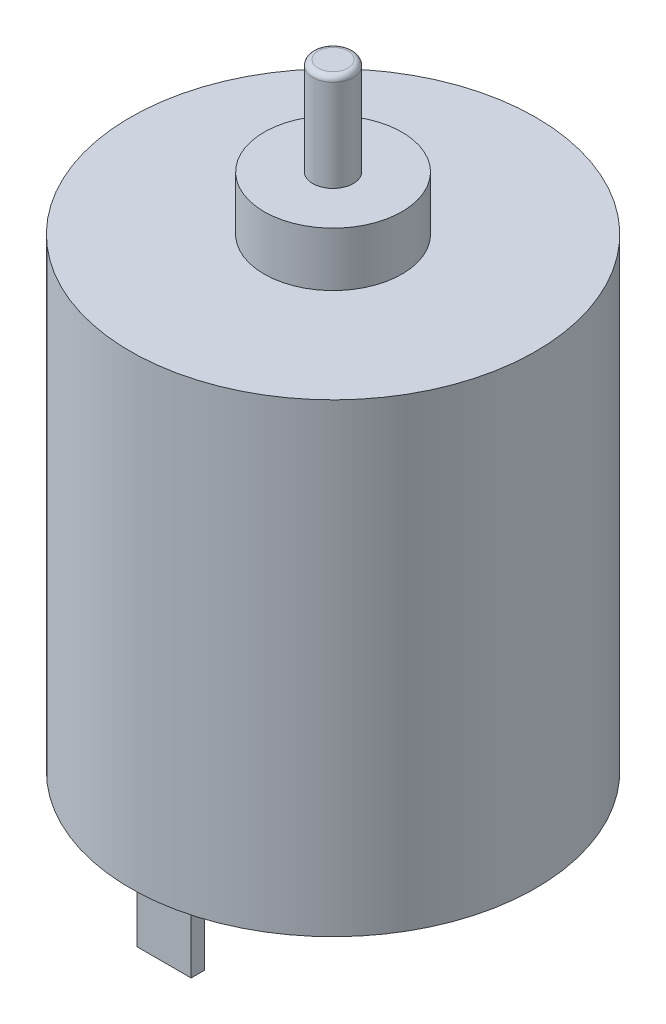
ISO-10303-21;
HEADER;
FILE_DESCRIPTION(('STEP AP214'),'2;1');
FILE_NAME('part.step','',(''),(''),'','','');
FILE_SCHEMA(('AUTOMOTIVE_DESIGN { 1 0 10303 214 1 1 1 1 }'));
ENDSEC;
DATA;
#1=APPLICATION_CONTEXT('core data for automotive mechanical design processes');
#2=APPLICATION_PROTOCOL_DEFINITION('international standard','automotive_design',2000,#1);
#3=PRODUCT_CONTEXT('',#1,'mechanical');
#4=PRODUCT('Part','Part','',(#3));
#5=PRODUCT_RELATED_PRODUCT_CATEGORY('part','',(#4));
#6=PRODUCT_DEFINITION_FORMATION('','',#4);
#7=PRODUCT_DEFINITION_CONTEXT('part definition',#1,'design');
#8=PRODUCT_DEFINITION('design','',#6,#7);
#9=PRODUCT_DEFINITION_SHAPE('','',#8);
#10=(LENGTH_UNIT() NAMED_UNIT(*) SI_UNIT(.MILLI.,.METRE.));
#11=(NAMED_UNIT(*) PLANE_ANGLE_UNIT() SI_UNIT($,.RADIAN.));
#12=(NAMED_UNIT(*) SI_UNIT($,.STERADIAN.) SOLID_ANGLE_UNIT());
#13=UNCERTAINTY_MEASURE_WITH_UNIT(LENGTH_MEASURE(1.E-05),#10,'distance_accuracy_value','');
#14=(GEOMETRIC_REPRESENTATION_CONTEXT(3) GLOBAL_UNCERTAINTY_ASSIGNED_CONTEXT((#13)) GLOBAL_UNIT_ASSIGNED_CONTEXT((#10,
#11,#12)) REPRESENTATION_CONTEXT('',''));
#15=CARTESIAN_POINT('',(0.,0.,0.));
#16=DIRECTION('',(0.,0.,1.));
#17=DIRECTION('',(1.,0.,0.));
#18=AXIS2_PLACEMENT_3D('',#15,#16,#17);
#19=CARTESIAN_POINT('',(0.,0.,0.));
#20=DIRECTION('',(0.,1.,0.));
#21=DIRECTION('',(0.,0.,1.));
#22=AXIS2_PLACEMENT_3D('',#19,#20,#21);
#23=PLANE('',#22);
#24=DIRECTION('',(0.,0.,1.));
#25=VECTOR('',#24,1.);
#26=CARTESIAN_POINT('',(0.999999999999997,0.,5.75000000000001));
#27=LINE('',#26,#25);
#28=CARTESIAN_POINT('',(0.999999999999997,0.,5.75000000000001));
#29=VERTEX_POINT('',#28);
#30=CARTESIAN_POINT('',(1.00000000000001,0.,6.25000000000002));
#31=VERTEX_POINT('',#30);
#32=EDGE_CURVE('E122',#29,#31,#27,.T.);
#33=ORIENTED_EDGE('',*,*,#32,.F.);
#34=DIRECTION('',(1.,0.,0.));
#35=VECTOR('',#34,1.);
#36=CARTESIAN_POINT('',(-1.,0.,5.75000000000001));
#37=LINE('',#36,#35);
#38=CARTESIAN_POINT('',(-1.,0.,5.75000000000001));
#39=VERTEX_POINT('',#38);
#40=EDGE_CURVE('E135',#39,#29,#37,.T.);
#41=ORIENTED_EDGE('',*,*,#40,.F.);
#42=DIRECTION('',(0.,0.,-1.));
#43=VECTOR('',#42,1.);
#44=CARTESIAN_POINT('',(-1.,0.,5.75000000000001));
#45=LINE('',#44,#43);
#46=CARTESIAN_POINT('',(-1.,0.,6.25000000000002));
#47=VERTEX_POINT('',#46);
#48=EDGE_CURVE('E144',#47,#39,#45,.T.);
#49=ORIENTED_EDGE('',*,*,#48,.F.);
#50=DIRECTION('',(-1.,0.,0.));
#51=VECTOR('',#50,1.);
#52=CARTESIAN_POINT('',(-1.,0.,6.25000000000002));
#53=LINE('',#52,#51);
#54=EDGE_CURVE('E125',#31,#47,#53,.T.);
#55=ORIENTED_EDGE('',*,*,#54,.F.);
#56=EDGE_LOOP('',(#33,#41,#49,#55));
#57=FACE_BOUND('',#56,.T.);
#58=CARTESIAN_POINT('',(0.,0.,0.));
#59=DIRECTION('',(0.,1.,0.));
#60=DIRECTION('',(0.,0.,1.));
#61=AXIS2_PLACEMENT_3D('',#58,#59,#60);
#62=CIRCLE('',#61,7.5);
#63=CARTESIAN_POINT('',(0.,0.,-7.50000000000002));
#64=VERTEX_POINT('',#63);
#65=EDGE_CURVE('E167',#64,#64,#62,.T.);
#66=ORIENTED_EDGE('',*,*,#65,.F.);
#67=EDGE_LOOP('',(#66));
#68=FACE_BOUND('',#67,.T.);
#69=DIRECTION('',(0.,0.,1.));
#70=VECTOR('',#69,1.);
#71=CARTESIAN_POINT('',(1.,0.,-5.75000000000001));
#72=LINE('',#71,#70);
#73=CARTESIAN_POINT('',(1.00000000000002,0.,-6.25000000000003));
#74=VERTEX_POINT('',#73);
#75=CARTESIAN_POINT('',(1.,0.,-5.75000000000001));
#76=VERTEX_POINT('',#75);
#77=EDGE_CURVE('E121',#74,#76,#72,.T.);
#78=ORIENTED_EDGE('',*,*,#77,.F.);
#79=DIRECTION('',(1.,0.,0.));
#80=VECTOR('',#79,1.);
#81=CARTESIAN_POINT('',(-1.,0.,-6.25000000000003));
#82=LINE('',#81,#80);
#83=CARTESIAN_POINT('',(-1.,0.,-6.25000000000003));
#84=VERTEX_POINT('',#83);
#85=EDGE_CURVE('E118',#84,#74,#82,.T.);
#86=ORIENTED_EDGE('',*,*,#85,.F.);
#87=DIRECTION('',(0.,0.,-1.));
#88=VECTOR('',#87,1.);
#89=CARTESIAN_POINT('',(-1.,0.,-5.75000000000001));
#90=LINE('',#89,#88);
#91=CARTESIAN_POINT('',(-1.,0.,-5.75000000000001));
#92=VERTEX_POINT('',#91);
#93=EDGE_CURVE('E56',#92,#84,#90,.T.);
#94=ORIENTED_EDGE('',*,*,#93,.F.);
#95=DIRECTION('',(-1.,0.,0.));
#96=VECTOR('',#95,1.);
#97=CARTESIAN_POINT('',(-1.,0.,-5.75000000000001));
#98=LINE('',#97,#96);
#99=EDGE_CURVE('E51',#76,#92,#98,.T.);
#100=ORIENTED_EDGE('',*,*,#99,.F.);
#101=EDGE_LOOP('',(#78,#86,#94,#100));
#102=FACE_BOUND('',#101,.T.);
#103=ADVANCED_FACE('F36',(#57,#68,#102),#23,.F.);
#104=CARTESIAN_POINT('',(0.,19.2,0.));
#105=DIRECTION('',(0.,1.,0.));
#106=DIRECTION('',(0.,0.,1.));
#107=AXIS2_PLACEMENT_3D('',#104,#105,#106);
#108=PLANE('',#107);
#109=CARTESIAN_POINT('',(0.,19.2,0.));
#110=DIRECTION('',(0.,1.,0.));
#111=DIRECTION('',(0.,0.,1.));
#112=AXIS2_PLACEMENT_3D('',#109,#110,#111);
#113=CIRCLE('',#112,2.55);
#114=CARTESIAN_POINT('',(0.,19.2,2.55000000000001));
#115=VERTEX_POINT('',#114);
#116=EDGE_CURVE('E164',#115,#115,#113,.T.);
#117=ORIENTED_EDGE('',*,*,#116,.T.);
#118=EDGE_LOOP('',(#117));
#119=FACE_BOUND('',#118,.T.);
#120=CARTESIAN_POINT('',(0.,19.2,0.));
#121=DIRECTION('',(0.,1.,0.));
#122=DIRECTION('',(0.,0.,1.));
#123=AXIS2_PLACEMENT_3D('',#120,#121,#122);
#124=CIRCLE('',#123,0.75);
#125=CARTESIAN_POINT('',(0.,19.2,0.750000000000003));
#126=VERTEX_POINT('',#125);
#127=EDGE_CURVE('E160',#126,#126,#124,.T.);
#128=ORIENTED_EDGE('',*,*,#127,.F.);
#129=EDGE_LOOP('',(#128));
#130=FACE_BOUND('',#129,.T.);
#131=ADVANCED_FACE('F188',(#119,#130),#108,.T.);
#132=CARTESIAN_POINT('',(0.,17.2,0.));
#133=DIRECTION('',(0.,1.,0.));
#134=DIRECTION('',(0.,0.,1.));
#135=AXIS2_PLACEMENT_3D('',#132,#133,#134);
#136=PLANE('',#135);
#137=CARTESIAN_POINT('',(0.,17.2,0.));
#138=DIRECTION('',(0.,1.,0.));
#139=DIRECTION('',(0.,0.,1.));
#140=AXIS2_PLACEMENT_3D('',#137,#138,#139);
#141=CIRCLE('',#140,7.5);
#142=CARTESIAN_POINT('',(0.,17.2,-7.50000000000002));
#143=VERTEX_POINT('',#142);
#144=EDGE_CURVE('E170',#143,#143,#141,.T.);
#145=ORIENTED_EDGE('',*,*,#144,.T.);
#146=EDGE_LOOP('',(#145));
#147=FACE_BOUND('',#146,.T.);
#148=CARTESIAN_POINT('',(0.,17.2,0.));
#149=DIRECTION('',(0.,1.,0.));
#150=DIRECTION('',(0.,0.,1.));
#151=AXIS2_PLACEMENT_3D('',#148,#149,#150);
#152=CIRCLE('',#151,2.55);
#153=CARTESIAN_POINT('',(0.,17.2,2.55000000000001));
#154=VERTEX_POINT('',#153);
#155=EDGE_CURVE('E163',#154,#154,#152,.T.);
#156=ORIENTED_EDGE('',*,*,#155,.F.);
#157=EDGE_LOOP('',(#156));
#158=FACE_BOUND('',#157,.T.);
#159=ADVANCED_FACE('F194',(#147,#158),#136,.T.);
#160=CARTESIAN_POINT('',(0.,17.2,0.));
#161=DIRECTION('',(0.,-1.,0.));
#162=DIRECTION('',(0.,0.,-1.));
#163=AXIS2_PLACEMENT_3D('',#160,#161,#162);
#164=CYLINDRICAL_SURFACE('',#163,7.5);
#165=CARTESIAN_POINT('',(0.,17.2,-7.50000000000002));
#166=CARTESIAN_POINT('',(0.,17.0208333333333,-7.50000000000002));
#167=CARTESIAN_POINT('',(0.,16.8416666666667,-7.50000000000002));
#168=CARTESIAN_POINT('',(0.,16.4833333333333,-7.50000000000002));
#169=CARTESIAN_POINT('',(0.,16.3041666666667,-7.50000000000002));
#170=CARTESIAN_POINT('',(0.,15.9458333333333,-7.50000000000002));
#171=CARTESIAN_POINT('',(0.,15.7666666666667,-7.50000000000002));
#172=CARTESIAN_POINT('',(0.,15.4083333333333,-7.50000000000002));
#173=CARTESIAN_POINT('',(0.,15.2291666666667,-7.50000000000002));
#174=CARTESIAN_POINT('',(0.,14.8708333333333,-7.50000000000002));
#175=CARTESIAN_POINT('',(0.,14.6916666666667,-7.50000000000002));
#176=CARTESIAN_POINT('',(0.,14.3333333333333,-7.50000000000002));
#177=CARTESIAN_POINT('',(0.,14.1541666666667,-7.50000000000002));
#178=CARTESIAN_POINT('',(0.,13.7958333333333,-7.50000000000002));
#179=CARTESIAN_POINT('',(0.,13.6166666666667,-7.50000000000002));
#180=CARTESIAN_POINT('',(0.,13.2583333333333,-7.50000000000002));
#181=CARTESIAN_POINT('',(0.,13.0791666666667,-7.50000000000002));
#182=CARTESIAN_POINT('',(0.,12.7208333333333,-7.50000000000002));
#183=CARTESIAN_POINT('',(0.,12.5416666666667,-7.50000000000002));
#184=CARTESIAN_POINT('',(0.,12.1833333333333,-7.50000000000002));
#185=CARTESIAN_POINT('',(0.,12.0041666666667,-7.50000000000002));
#186=CARTESIAN_POINT('',(0.,11.6458333333333,-7.50000000000002));
#187=CARTESIAN_POINT('',(0.,11.4666666666667,-7.50000000000002));
#188=CARTESIAN_POINT('',(0.,11.1083333333333,-7.50000000000002));
#189=CARTESIAN_POINT('',(0.,10.9291666666667,-7.50000000000002));
#190=CARTESIAN_POINT('',(0.,10.5708333333333,-7.50000000000002));
#191=CARTESIAN_POINT('',(0.,10.3916666666667,-7.50000000000002));
#192=CARTESIAN_POINT('',(0.,10.0333333333333,-7.50000000000002));
#193=CARTESIAN_POINT('',(0.,9.85416666666666,-7.50000000000002));
#194=CARTESIAN_POINT('',(0.,9.49583333333333,-7.50000000000002));
#195=CARTESIAN_POINT('',(0.,9.31666666666666,-7.50000000000002));
#196=CARTESIAN_POINT('',(0.,8.95833333333333,-7.50000000000002));
#197=CARTESIAN_POINT('',(0.,8.77916666666666,-7.50000000000002));
#198=CARTESIAN_POINT('',(0.,8.42083333333333,-7.50000000000002));
#199=CARTESIAN_POINT('',(0.,8.24166666666666,-7.50000000000002));
#200=CARTESIAN_POINT('',(0.,7.88333333333333,-7.50000000000002));
#201=CARTESIAN_POINT('',(0.,7.70416666666666,-7.50000000000002));
#202=CARTESIAN_POINT('',(0.,7.34583333333333,-7.50000000000002));
#203=CARTESIAN_POINT('',(0.,7.16666666666666,-7.50000000000002));
#204=CARTESIAN_POINT('',(0.,6.80833333333333,-7.50000000000002));
#205=CARTESIAN_POINT('',(0.,6.62916666666666,-7.50000000000002));
#206=CARTESIAN_POINT('',(0.,6.27083333333333,-7.50000000000002));
#207=CARTESIAN_POINT('',(0.,6.09166666666666,-7.50000000000002));
#208=CARTESIAN_POINT('',(0.,5.73333333333333,-7.50000000000002));
#209=CARTESIAN_POINT('',(0.,5.55416666666666,-7.50000000000002));
#210=CARTESIAN_POINT('',(0.,5.19583333333333,-7.50000000000002));
#211=CARTESIAN_POINT('',(0.,5.01666666666666,-7.50000000000002));
#212=CARTESIAN_POINT('',(0.,4.65833333333333,-7.50000000000002));
#213=CARTESIAN_POINT('',(0.,4.47916666666666,-7.50000000000002));
#214=CARTESIAN_POINT('',(0.,4.12083333333333,-7.50000000000002));
#215=CARTESIAN_POINT('',(0.,3.94166666666666,-7.50000000000002));
#216=CARTESIAN_POINT('',(0.,3.58333333333333,-7.50000000000002));
#217=CARTESIAN_POINT('',(0.,3.40416666666666,-7.50000000000002));
#218=CARTESIAN_POINT('',(0.,3.04583333333333,-7.50000000000002));
#219=CARTESIAN_POINT('',(0.,2.86666666666666,-7.50000000000002));
#220=CARTESIAN_POINT('',(0.,2.50833333333333,-7.50000000000002));
#221=CARTESIAN_POINT('',(0.,2.32916666666666,-7.50000000000002));
#222=CARTESIAN_POINT('',(0.,1.97083333333333,-7.50000000000002));
#223=CARTESIAN_POINT('',(0.,1.79166666666666,-7.50000000000002));
#224=CARTESIAN_POINT('',(0.,1.43333333333333,-7.50000000000002));
#225=CARTESIAN_POINT('',(0.,1.25416666666666,-7.50000000000002));
#226=CARTESIAN_POINT('',(0.,0.895833333333329,-7.50000000000002));
#227=CARTESIAN_POINT('',(0.,0.716666666666663,-7.50000000000002));
#228=CARTESIAN_POINT('',(0.,0.35833333333333,-7.50000000000002));
#229=CARTESIAN_POINT('',(0.,0.179166666666663,-7.50000000000002));
#230=CARTESIAN_POINT('',(0.,0.,-7.50000000000002));
#231=B_SPLINE_CURVE_WITH_KNOTS('',3,(#165,#166,#167,#168,#169,#170,#171,#172,#173,#174,#175,
#176,#177,#178,#179,#180,#181,#182,#183,#184,#185,#186,#187,#188,#189,#190,#191,#192,#193,#194,
#195,#196,#197,#198,#199,#200,#201,#202,#203,#204,#205,#206,#207,#208,#209,#210,#211,#212,#213,
#214,#215,#216,#217,#218,#219,#220,#221,#222,#223,#224,#225,#226,#227,#228,#229,#230),
.UNSPECIFIED.,.F.,.F.,(4,2,2,2,2,2,2,2,2,2,2,2,2,2,2,2,2,2,2,2,2,2,2,2,2,2,2,2,2,2,2,2,4),(0.,
0.537500000000003,1.075,1.6125,2.15,2.6875,3.225,3.7625,4.3,4.8375,5.375,5.9125,6.45,6.9875,
7.525,8.0625,8.6,9.1375,9.675,10.2125,10.75,11.2875,11.825,12.3625,12.9,13.4375,13.975,14.5125,
15.05,15.5875,16.125,16.6625,17.2),.UNSPECIFIED.);
#232=EDGE_CURVE('BSEAM200',#143,#64,#231,.T.);
#233=ORIENTED_EDGE('',*,*,#144,.F.);
#234=ORIENTED_EDGE('',*,*,#65,.T.);
#235=ORIENTED_EDGE('',*,*,#232,.T.);
#236=ORIENTED_EDGE('',*,*,#232,.F.);
#237=EDGE_LOOP('',(#233,#235,#234,#236));
#238=FACE_BOUND('',#237,.T.);
#239=ADVANCED_FACE('F200',(#238),#164,.T.);
#240=CARTESIAN_POINT('',(0.,19.2,0.));
#241=DIRECTION('',(0.,-1.,0.));
#242=DIRECTION('',(0.,0.,-1.));
#243=AXIS2_PLACEMENT_3D('',#240,#241,#242);
#244=CYLINDRICAL_SURFACE('',#243,2.55);
#245=ORIENTED_EDGE('',*,*,#116,.F.);
#246=EDGE_LOOP('',(#245));
#247=FACE_BOUND('',#246,.T.);
#248=ORIENTED_EDGE('',*,*,#155,.T.);
#249=EDGE_LOOP('',(#248));
#250=FACE_BOUND('',#249,.T.);
#251=ADVANCED_FACE('F202',(#247,#250),#244,.T.);
#252=CARTESIAN_POINT('',(0.,22.8,0.));
#253=DIRECTION('',(0.,-1.,0.));
#254=DIRECTION('',(0.,0.,-1.));
#255=AXIS2_PLACEMENT_3D('',#252,#253,#254);
#256=CYLINDRICAL_SURFACE('',#255,0.75);
#257=CARTESIAN_POINT('',(0.,22.6,0.));
#258=DIRECTION('',(0.,1.,0.));
#259=DIRECTION('',(0.,0.,1.));
#260=AXIS2_PLACEMENT_3D('',#257,#258,#259);
#261=CIRCLE('',#260,0.75);
#262=CARTESIAN_POINT('',(0.,22.6,0.750000000000003));
#263=VERTEX_POINT('',#262);
#264=EDGE_CURVE('E11',#263,#263,#261,.F.);
#265=ORIENTED_EDGE('',*,*,#264,.T.);
#266=EDGE_LOOP('',(#265));
#267=FACE_BOUND('',#266,.T.);
#268=ORIENTED_EDGE('',*,*,#127,.T.);
#269=EDGE_LOOP('',(#268));
#270=FACE_BOUND('',#269,.T.);
#271=ADVANCED_FACE('F208',(#267,#270),#256,.T.);
#272=CARTESIAN_POINT('',(0.,22.8,0.));
#273=DIRECTION('',(0.,1.,0.));
#274=DIRECTION('',(0.,0.,1.));
#275=AXIS2_PLACEMENT_3D('',#272,#273,#274);
#276=PLANE('',#275);
#277=CARTESIAN_POINT('',(0.,22.8,0.));
#278=DIRECTION('',(0.,1.,0.));
#279=DIRECTION('',(0.,0.,1.));
#280=AXIS2_PLACEMENT_3D('',#277,#278,#279);
#281=CIRCLE('',#280,0.55);
#282=CARTESIAN_POINT('',(0.,22.8,0.550000000000002));
#283=VERTEX_POINT('',#282);
#284=EDGE_CURVE('E44',#283,#283,#281,.T.);
#285=ORIENTED_EDGE('',*,*,#284,.T.);
#286=EDGE_LOOP('',(#285));
#287=FACE_BOUND('',#286,.T.);
#288=ADVANCED_FACE('F177',(#287),#276,.T.);
#289=CARTESIAN_POINT('',(0.999999999999997,-3.,5.75000000000001));
#290=DIRECTION('',(-1.,0.,0.));
#291=DIRECTION('',(0.,0.,1.));
#292=AXIS2_PLACEMENT_3D('',#289,#290,#291);
#293=PLANE('',#292);
#294=ORIENTED_EDGE('',*,*,#32,.T.);
#295=DIRECTION('',(0.,1.,0.));
#296=VECTOR('',#295,1.);
#297=CARTESIAN_POINT('',(1.00000000000001,-3.,6.25000000000002));
#298=LINE('',#297,#296);
#299=CARTESIAN_POINT('',(1.00000000000001,-3.,6.25000000000002));
#300=VERTEX_POINT('',#299);
#301=EDGE_CURVE('E157',#300,#31,#298,.T.);
#302=ORIENTED_EDGE('',*,*,#301,.F.);
#303=DIRECTION('',(0.,0.,1.));
#304=VECTOR('',#303,1.);
#305=CARTESIAN_POINT('',(0.999999999999997,-3.,5.75000000000001));
#306=LINE('',#305,#304);
#307=CARTESIAN_POINT('',(0.999999999999997,-3.,5.75000000000001));
#308=VERTEX_POINT('',#307);
#309=EDGE_CURVE('E131',#308,#300,#306,.T.);
#310=ORIENTED_EDGE('',*,*,#309,.F.);
#311=DIRECTION('',(0.,1.,0.));
#312=VECTOR('',#311,1.);
#313=CARTESIAN_POINT('',(0.999999999999997,-3.,5.75000000000001));
#314=LINE('',#313,#312);
#315=EDGE_CURVE('E140',#308,#29,#314,.T.);
#316=ORIENTED_EDGE('',*,*,#315,.T.);
#317=EDGE_LOOP('',(#294,#302,#310,#316));
#318=FACE_BOUND('',#317,.T.);
#319=ADVANCED_FACE('F254',(#318),#293,.F.);
#320=CARTESIAN_POINT('',(-1.,-3.,6.25000000000002));
#321=DIRECTION('',(0.,0.,-1.));
#322=DIRECTION('',(-1.,0.,0.));
#323=AXIS2_PLACEMENT_3D('',#320,#321,#322);
#324=PLANE('',#323);
#325=ORIENTED_EDGE('',*,*,#54,.T.);
#326=DIRECTION('',(0.,1.,0.));
#327=VECTOR('',#326,1.);
#328=CARTESIAN_POINT('',(-1.,-3.,6.25000000000002));
#329=LINE('',#328,#327);
#330=CARTESIAN_POINT('',(-1.,-3.,6.25000000000002));
#331=VERTEX_POINT('',#330);
#332=EDGE_CURVE('E154',#331,#47,#329,.T.);
#333=ORIENTED_EDGE('',*,*,#332,.F.);
#334=DIRECTION('',(-1.,0.,0.));
#335=VECTOR('',#334,1.);
#336=CARTESIAN_POINT('',(-1.,-3.,6.25000000000002));
#337=LINE('',#336,#335);
#338=EDGE_CURVE('E134',#300,#331,#337,.T.);
#339=ORIENTED_EDGE('',*,*,#338,.F.);
#340=ORIENTED_EDGE('',*,*,#301,.T.);
#341=EDGE_LOOP('',(#325,#333,#339,#340));
#342=FACE_BOUND('',#341,.T.);
#343=ADVANCED_FACE('F250',(#342),#324,.F.);
#344=CARTESIAN_POINT('',(-1.,-3.,5.75000000000001));
#345=DIRECTION('',(1.,0.,0.));
#346=DIRECTION('',(0.,0.,-1.));
#347=AXIS2_PLACEMENT_3D('',#344,#345,#346);
#348=PLANE('',#347);
#349=ORIENTED_EDGE('',*,*,#48,.T.);
#350=DIRECTION('',(0.,1.,0.));
#351=VECTOR('',#350,1.);
#352=CARTESIAN_POINT('',(-1.,-3.,5.75000000000001));
#353=LINE('',#352,#351);
#354=CARTESIAN_POINT('',(-1.,-3.,5.75000000000001));
#355=VERTEX_POINT('',#354);
#356=EDGE_CURVE('E151',#355,#39,#353,.T.);
#357=ORIENTED_EDGE('',*,*,#356,.F.);
#358=DIRECTION('',(0.,0.,-1.));
#359=VECTOR('',#358,1.);
#360=CARTESIAN_POINT('',(-1.,-3.,5.75000000000001));
#361=LINE('',#360,#359);
#362=EDGE_CURVE('E137',#331,#355,#361,.T.);
#363=ORIENTED_EDGE('',*,*,#362,.F.);
#364=ORIENTED_EDGE('',*,*,#332,.T.);
#365=EDGE_LOOP('',(#349,#357,#363,#364));
#366=FACE_BOUND('',#365,.T.);
#367=ADVANCED_FACE('F246',(#366),#348,.F.);
#368=CARTESIAN_POINT('',(-1.,-3.,5.75000000000001));
#369=DIRECTION('',(0.,0.,1.));
#370=DIRECTION('',(1.,0.,0.));
#371=AXIS2_PLACEMENT_3D('',#368,#369,#370);
#372=PLANE('',#371);
#373=ORIENTED_EDGE('',*,*,#40,.T.);
#374=ORIENTED_EDGE('',*,*,#315,.F.);
#375=DIRECTION('',(1.,0.,0.));
#376=VECTOR('',#375,1.);
#377=CARTESIAN_POINT('',(-1.,-3.,5.75000000000001));
#378=LINE('',#377,#376);
#379=EDGE_CURVE('E139',#355,#308,#378,.T.);
#380=ORIENTED_EDGE('',*,*,#379,.F.);
#381=ORIENTED_EDGE('',*,*,#356,.T.);
#382=EDGE_LOOP('',(#373,#374,#380,#381));
#383=FACE_BOUND('',#382,.T.);
#384=ADVANCED_FACE('F242',(#383),#372,.F.);
#385=CARTESIAN_POINT('',(1.00000000000001,-3.,6.25000000000002));
#386=DIRECTION('',(0.,1.,0.));
#387=DIRECTION('',(0.,0.,1.));
#388=AXIS2_PLACEMENT_3D('',#385,#386,#387);
#389=PLANE('',#388);
#390=ORIENTED_EDGE('',*,*,#309,.T.);
#391=ORIENTED_EDGE('',*,*,#338,.T.);
#392=ORIENTED_EDGE('',*,*,#362,.T.);
#393=ORIENTED_EDGE('',*,*,#379,.T.);
#394=EDGE_LOOP('',(#390,#391,#392,#393));
#395=FACE_BOUND('',#394,.T.);
#396=ADVANCED_FACE('F239',(#395),#389,.F.);
#397=CARTESIAN_POINT('',(1.,-3.,-5.75000000000001));
#398=DIRECTION('',(-1.,0.,0.));
#399=DIRECTION('',(0.,0.,1.));
#400=AXIS2_PLACEMENT_3D('',#397,#398,#399);
#401=PLANE('',#400);
#402=ORIENTED_EDGE('',*,*,#77,.T.);
#403=DIRECTION('',(0.,1.,0.));
#404=VECTOR('',#403,1.);
#405=CARTESIAN_POINT('',(1.,-3.,-5.75000000000001));
#406=LINE('',#405,#404);
#407=CARTESIAN_POINT('',(1.,-3.,-5.75000000000001));
#408=VERTEX_POINT('',#407);
#409=EDGE_CURVE('E102',#408,#76,#406,.T.);
#410=ORIENTED_EDGE('',*,*,#409,.F.);
#411=DIRECTION('',(0.,0.,1.));
#412=VECTOR('',#411,1.);
#413=CARTESIAN_POINT('',(1.,-3.,-5.75000000000001));
#414=LINE('',#413,#412);
#415=CARTESIAN_POINT('',(1.00000000000002,-3.,-6.25000000000003));
#416=VERTEX_POINT('',#415);
#417=EDGE_CURVE('E109',#416,#408,#414,.T.);
#418=ORIENTED_EDGE('',*,*,#417,.F.);
#419=DIRECTION('',(0.,1.,0.));
#420=VECTOR('',#419,1.);
#421=CARTESIAN_POINT('',(1.00000000000002,-3.,-6.25000000000003));
#422=LINE('',#421,#420);
#423=EDGE_CURVE('E218',#416,#74,#422,.T.);
#424=ORIENTED_EDGE('',*,*,#423,.T.);
#425=EDGE_LOOP('',(#402,#410,#418,#424));
#426=FACE_BOUND('',#425,.T.);
#427=ADVANCED_FACE('F120',(#426),#401,.F.);
#428=CARTESIAN_POINT('',(-1.,-3.,-5.75000000000001));
#429=DIRECTION('',(0.,0.,-1.));
#430=DIRECTION('',(-1.,0.,0.));
#431=AXIS2_PLACEMENT_3D('',#428,#429,#430);
#432=PLANE('',#431);
#433=ORIENTED_EDGE('',*,*,#99,.T.);
#434=DIRECTION('',(0.,1.,0.));
#435=VECTOR('',#434,1.);
#436=CARTESIAN_POINT('',(-1.,-3.,-5.75000000000001));
#437=LINE('',#436,#435);
#438=CARTESIAN_POINT('',(-1.,-3.,-5.75000000000001));
#439=VERTEX_POINT('',#438);
#440=EDGE_CURVE('E105',#439,#92,#437,.T.);
#441=ORIENTED_EDGE('',*,*,#440,.F.);
#442=DIRECTION('',(-1.,0.,0.));
#443=VECTOR('',#442,1.);
#444=CARTESIAN_POINT('',(-1.,-3.,-5.75000000000001));
#445=LINE('',#444,#443);
#446=EDGE_CURVE('E98',#408,#439,#445,.T.);
#447=ORIENTED_EDGE('',*,*,#446,.F.);
#448=ORIENTED_EDGE('',*,*,#409,.T.);
#449=EDGE_LOOP('',(#433,#441,#447,#448));
#450=FACE_BOUND('',#449,.T.);
#451=ADVANCED_FACE('F100',(#450),#432,.F.);
#452=CARTESIAN_POINT('',(-1.,-3.,-5.75000000000001));
#453=DIRECTION('',(1.,0.,0.));
#454=DIRECTION('',(0.,0.,-1.));
#455=AXIS2_PLACEMENT_3D('',#452,#453,#454);
#456=PLANE('',#455);
#457=ORIENTED_EDGE('',*,*,#93,.T.);
#458=DIRECTION('',(0.,1.,0.));
#459=VECTOR('',#458,1.);
#460=CARTESIAN_POINT('',(-1.,-3.,-6.25000000000003));
#461=LINE('',#460,#459);
#462=CARTESIAN_POINT('',(-1.,-3.,-6.25000000000003));
#463=VERTEX_POINT('',#462);
#464=EDGE_CURVE('E127',#463,#84,#461,.T.);
#465=ORIENTED_EDGE('',*,*,#464,.F.);
#466=DIRECTION('',(0.,0.,-1.));
#467=VECTOR('',#466,1.);
#468=CARTESIAN_POINT('',(-1.,-3.,-5.75000000000001));
#469=LINE('',#468,#467);
#470=EDGE_CURVE('E108',#439,#463,#469,.T.);
#471=ORIENTED_EDGE('',*,*,#470,.F.);
#472=ORIENTED_EDGE('',*,*,#440,.T.);
#473=EDGE_LOOP('',(#457,#465,#471,#472));
#474=FACE_BOUND('',#473,.T.);
#475=ADVANCED_FACE('F227',(#474),#456,.F.);
#476=CARTESIAN_POINT('',(-1.,-3.,-6.25000000000003));
#477=DIRECTION('',(0.,0.,1.));
#478=DIRECTION('',(1.,0.,0.));
#479=AXIS2_PLACEMENT_3D('',#476,#477,#478);
#480=PLANE('',#479);
#481=ORIENTED_EDGE('',*,*,#85,.T.);
#482=ORIENTED_EDGE('',*,*,#423,.F.);
#483=DIRECTION('',(1.,0.,0.));
#484=VECTOR('',#483,1.);
#485=CARTESIAN_POINT('',(-1.,-3.,-6.25000000000003));
#486=LINE('',#485,#484);
#487=EDGE_CURVE('E114',#463,#416,#486,.T.);
#488=ORIENTED_EDGE('',*,*,#487,.F.);
#489=ORIENTED_EDGE('',*,*,#464,.T.);
#490=EDGE_LOOP('',(#481,#482,#488,#489));
#491=FACE_BOUND('',#490,.T.);
#492=ADVANCED_FACE('F184',(#491),#480,.F.);
#493=CARTESIAN_POINT('',(1.00000000000002,-3.,-6.25000000000003));
#494=DIRECTION('',(0.,-1.,0.));
#495=DIRECTION('',(0.,0.,-1.));
#496=AXIS2_PLACEMENT_3D('',#493,#494,#495);
#497=PLANE('',#496);
#498=ORIENTED_EDGE('',*,*,#417,.T.);
#499=ORIENTED_EDGE('',*,*,#446,.T.);
#500=ORIENTED_EDGE('',*,*,#470,.T.);
#501=ORIENTED_EDGE('',*,*,#487,.T.);
#502=EDGE_LOOP('',(#498,#499,#500,#501));
#503=FACE_BOUND('',#502,.T.);
#504=ADVANCED_FACE('F112',(#503),#497,.T.);
#505=CARTESIAN_POINT('',(0.,22.6,0.));
#506=DIRECTION('',(0.,1.,0.));
#507=DIRECTION('',(0.,0.,1.));
#508=AXIS2_PLACEMENT_3D('',#505,#506,#507);
#509=TOROIDAL_SURFACE('',#508,0.55,0.2);
#510=ORIENTED_EDGE('',*,*,#264,.F.);
#511=EDGE_LOOP('',(#510));
#512=FACE_BOUND('',#511,.T.);
#513=ORIENTED_EDGE('',*,*,#284,.F.);
#514=EDGE_LOOP('',(#513));
#515=FACE_BOUND('',#514,.T.);
#516=ADVANCED_FACE('F38',(#512,#515),#509,.T.);
#517=CLOSED_SHELL('',(#103,#131,#159,#239,#251,#271,#288,#319,#343,#367,#384,#396,#427,#451,
#475,#492,#504,#516));
#518=MANIFOLD_SOLID_BREP('B2',#517);
#519=ADVANCED_BREP_SHAPE_REPRESENTATION('',(#18,#518),#14);
#520=SHAPE_DEFINITION_REPRESENTATION(#9,#519);
ENDSEC;
END-ISO-10303-21;
